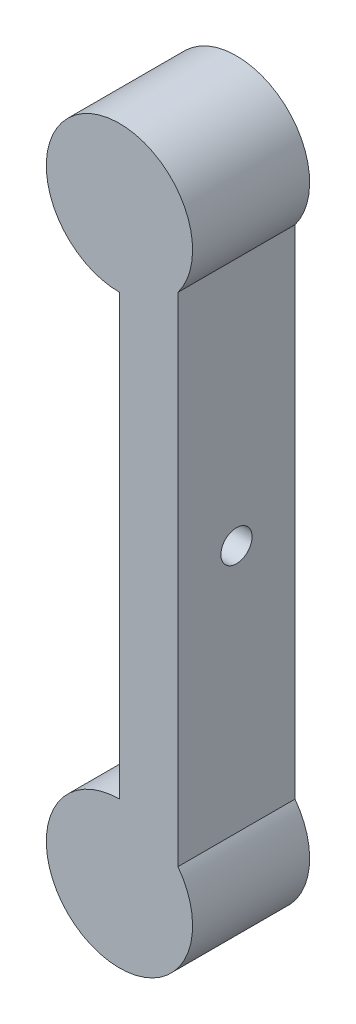
ISO-10303-21;
HEADER;
FILE_DESCRIPTION(('STEP AP214'),'2;1');
FILE_NAME('part.step','',(''),(''),'','','');
FILE_SCHEMA(('AUTOMOTIVE_DESIGN { 1 0 10303 214 1 1 1 1 }'));
ENDSEC;
DATA;
#1=APPLICATION_CONTEXT('core data for automotive mechanical design processes');
#2=APPLICATION_PROTOCOL_DEFINITION('international standard','automotive_design',2000,#1);
#3=PRODUCT_CONTEXT('',#1,'mechanical');
#4=PRODUCT('Part','Part','',(#3));
#5=PRODUCT_RELATED_PRODUCT_CATEGORY('part','',(#4));
#6=PRODUCT_DEFINITION_FORMATION('','',#4);
#7=PRODUCT_DEFINITION_CONTEXT('part definition',#1,'design');
#8=PRODUCT_DEFINITION('design','',#6,#7);
#9=PRODUCT_DEFINITION_SHAPE('','',#8);
#10=(LENGTH_UNIT() NAMED_UNIT(*) SI_UNIT(.MILLI.,.METRE.));
#11=(NAMED_UNIT(*) PLANE_ANGLE_UNIT() SI_UNIT($,.RADIAN.));
#12=(NAMED_UNIT(*) SI_UNIT($,.STERADIAN.) SOLID_ANGLE_UNIT());
#13=UNCERTAINTY_MEASURE_WITH_UNIT(LENGTH_MEASURE(1.E-05),#10,'distance_accuracy_value','');
#14=(GEOMETRIC_REPRESENTATION_CONTEXT(3) GLOBAL_UNCERTAINTY_ASSIGNED_CONTEXT((#13)) GLOBAL_UNIT_ASSIGNED_CONTEXT((#10,
#11,#12)) REPRESENTATION_CONTEXT('',''));
#15=CARTESIAN_POINT('',(0.,0.,0.));
#16=DIRECTION('',(0.,0.,1.));
#17=DIRECTION('',(1.,0.,0.));
#18=AXIS2_PLACEMENT_3D('',#15,#16,#17);
#19=CARTESIAN_POINT('',(0.,60.,0.));
#20=DIRECTION('',(0.,0.,1.));
#21=DIRECTION('',(1.,0.,0.));
#22=AXIS2_PLACEMENT_3D('',#19,#20,#21);
#23=PLANE('',#22);
#24=CARTESIAN_POINT('',(0.,60.,0.));
#25=DIRECTION('',(0.,0.,1.));
#26=DIRECTION('',(1.,0.,0.));
#27=AXIS2_PLACEMENT_3D('',#24,#25,#26);
#28=CIRCLE('',#27,7.5);
#29=CARTESIAN_POINT('',(6.,55.5,0.));
#30=VERTEX_POINT('',#29);
#31=CARTESIAN_POINT('',(0.,52.5,0.));
#32=VERTEX_POINT('',#31);
#33=EDGE_CURVE('E80',#30,#32,#28,.T.);
#34=ORIENTED_EDGE('',*,*,#33,.F.);
#35=DIRECTION('',(0.,1.,0.));
#36=VECTOR('',#35,1.);
#37=CARTESIAN_POINT('',(6.,55.5,0.));
#38=LINE('',#37,#36);
#39=CARTESIAN_POINT('',(6.00000000000001,4.49999999999999,0.));
#40=VERTEX_POINT('',#39);
#41=EDGE_CURVE('E49',#40,#30,#38,.T.);
#42=ORIENTED_EDGE('',*,*,#41,.F.);
#43=CARTESIAN_POINT('',(0.,0.,0.));
#44=DIRECTION('',(0.,0.,1.));
#45=DIRECTION('',(1.,0.,0.));
#46=AXIS2_PLACEMENT_3D('',#43,#44,#45);
#47=CIRCLE('',#46,7.5);
#48=CARTESIAN_POINT('',(0.,7.5,0.));
#49=VERTEX_POINT('',#48);
#50=EDGE_CURVE('E57',#49,#40,#47,.T.);
#51=ORIENTED_EDGE('',*,*,#50,.F.);
#52=DIRECTION('',(0.,-1.,0.));
#53=VECTOR('',#52,1.);
#54=CARTESIAN_POINT('',(0.,52.5,0.));
#55=LINE('',#54,#53);
#56=EDGE_CURVE('E114',#32,#49,#55,.T.);
#57=ORIENTED_EDGE('',*,*,#56,.F.);
#58=EDGE_LOOP('',(#34,#42,#51,#57));
#59=FACE_BOUND('',#58,.T.);
#60=CARTESIAN_POINT('',(0.,60.,0.));
#61=DIRECTION('',(0.,0.,1.));
#62=DIRECTION('',(1.,0.,0.));
#63=AXIS2_PLACEMENT_3D('',#60,#61,#62);
#64=CIRCLE('',#63,4.00000000000001);
#65=CARTESIAN_POINT('',(4.00000000000001,60.,0.));
#66=VERTEX_POINT('',#65);
#67=EDGE_CURVE('E110',#66,#66,#64,.T.);
#68=ORIENTED_EDGE('',*,*,#67,.T.);
#69=EDGE_LOOP('',(#68));
#70=FACE_BOUND('',#69,.T.);
#71=CARTESIAN_POINT('',(0.,0.,0.));
#72=DIRECTION('',(0.,0.,1.));
#73=DIRECTION('',(1.,0.,0.));
#74=AXIS2_PLACEMENT_3D('',#71,#72,#73);
#75=CIRCLE('',#74,4.);
#76=CARTESIAN_POINT('',(4.,0.,0.));
#77=VERTEX_POINT('',#76);
#78=EDGE_CURVE('E107',#77,#77,#75,.T.);
#79=ORIENTED_EDGE('',*,*,#78,.T.);
#80=EDGE_LOOP('',(#79));
#81=FACE_BOUND('',#80,.T.);
#82=ADVANCED_FACE('F33',(#59,#70,#81),#23,.F.);
#83=CARTESIAN_POINT('',(0.,60.,10.));
#84=DIRECTION('',(0.,0.,-1.));
#85=DIRECTION('',(-1.,0.,0.));
#86=AXIS2_PLACEMENT_3D('',#83,#84,#85);
#87=CYLINDRICAL_SURFACE('',#86,7.5);
#88=ORIENTED_EDGE('',*,*,#33,.T.);
#89=DIRECTION('',(0.,0.,-1.));
#90=VECTOR('',#89,1.);
#91=CARTESIAN_POINT('',(0.,52.5,10.));
#92=LINE('',#91,#90);
#93=CARTESIAN_POINT('',(0.,52.5,12.));
#94=VERTEX_POINT('',#93);
#95=EDGE_CURVE('E11',#94,#32,#92,.T.);
#96=ORIENTED_EDGE('',*,*,#95,.F.);
#97=CARTESIAN_POINT('',(0.,60.,12.));
#98=DIRECTION('',(0.,0.,1.));
#99=DIRECTION('',(1.,0.,0.));
#100=AXIS2_PLACEMENT_3D('',#97,#98,#99);
#101=CIRCLE('',#100,7.5);
#102=CARTESIAN_POINT('',(6.,55.5,12.));
#103=VERTEX_POINT('',#102);
#104=EDGE_CURVE('E78',#103,#94,#101,.T.);
#105=ORIENTED_EDGE('',*,*,#104,.F.);
#106=DIRECTION('',(0.,0.,-1.));
#107=VECTOR('',#106,1.);
#108=CARTESIAN_POINT('',(6.,55.5,10.));
#109=LINE('',#108,#107);
#110=EDGE_CURVE('E118',#103,#30,#109,.T.);
#111=ORIENTED_EDGE('',*,*,#110,.T.);
#112=EDGE_LOOP('',(#88,#96,#105,#111));
#113=FACE_BOUND('',#112,.T.);
#114=ADVANCED_FACE('F35',(#113),#87,.T.);
#115=CARTESIAN_POINT('',(0.,52.5,10.));
#116=DIRECTION('',(1.,0.,0.));
#117=DIRECTION('',(0.,1.,0.));
#118=AXIS2_PLACEMENT_3D('',#115,#116,#117);
#119=PLANE('',#118);
#120=CARTESIAN_POINT('',(0.,30.,6.));
#121=DIRECTION('',(-1.,0.,0.));
#122=DIRECTION('',(0.,-1.,0.));
#123=AXIS2_PLACEMENT_3D('',#120,#121,#122);
#124=CIRCLE('',#123,1.6);
#125=CARTESIAN_POINT('',(0.,28.4,6.));
#126=VERTEX_POINT('',#125);
#127=EDGE_CURVE('E96',#126,#126,#124,.T.);
#128=ORIENTED_EDGE('',*,*,#127,.F.);
#129=EDGE_LOOP('',(#128));
#130=FACE_BOUND('',#129,.T.);
#131=ORIENTED_EDGE('',*,*,#56,.T.);
#132=DIRECTION('',(0.,0.,-1.));
#133=VECTOR('',#132,1.);
#134=CARTESIAN_POINT('',(0.,7.5,10.));
#135=LINE('',#134,#133);
#136=CARTESIAN_POINT('',(0.,7.5,12.));
#137=VERTEX_POINT('',#136);
#138=EDGE_CURVE('E42',#137,#49,#135,.T.);
#139=ORIENTED_EDGE('',*,*,#138,.F.);
#140=DIRECTION('',(0.,-1.,0.));
#141=VECTOR('',#140,1.);
#142=CARTESIAN_POINT('',(0.,52.5,12.));
#143=LINE('',#142,#141);
#144=EDGE_CURVE('E83',#94,#137,#143,.T.);
#145=ORIENTED_EDGE('',*,*,#144,.F.);
#146=ORIENTED_EDGE('',*,*,#95,.T.);
#147=EDGE_LOOP('',(#131,#139,#145,#146));
#148=FACE_BOUND('',#147,.T.);
#149=ADVANCED_FACE('F84',(#130,#148),#119,.F.);
#150=CARTESIAN_POINT('',(0.,0.,10.));
#151=DIRECTION('',(0.,0.,-1.));
#152=DIRECTION('',(-1.,0.,0.));
#153=AXIS2_PLACEMENT_3D('',#150,#151,#152);
#154=CYLINDRICAL_SURFACE('',#153,7.5);
#155=ORIENTED_EDGE('',*,*,#50,.T.);
#156=DIRECTION('',(0.,0.,-1.));
#157=VECTOR('',#156,1.);
#158=CARTESIAN_POINT('',(6.00000000000001,4.49999999999999,10.));
#159=LINE('',#158,#157);
#160=CARTESIAN_POINT('',(6.00000000000001,4.49999999999999,12.));
#161=VERTEX_POINT('',#160);
#162=EDGE_CURVE('E120',#161,#40,#159,.T.);
#163=ORIENTED_EDGE('',*,*,#162,.F.);
#164=CARTESIAN_POINT('',(0.,0.,12.));
#165=DIRECTION('',(0.,0.,1.));
#166=DIRECTION('',(1.,0.,0.));
#167=AXIS2_PLACEMENT_3D('',#164,#165,#166);
#168=CIRCLE('',#167,7.5);
#169=EDGE_CURVE('E88',#137,#161,#168,.T.);
#170=ORIENTED_EDGE('',*,*,#169,.F.);
#171=ORIENTED_EDGE('',*,*,#138,.T.);
#172=EDGE_LOOP('',(#155,#163,#170,#171));
#173=FACE_BOUND('',#172,.T.);
#174=ADVANCED_FACE('F122',(#173),#154,.T.);
#175=CARTESIAN_POINT('',(6.,55.5,10.));
#176=DIRECTION('',(-1.,0.,0.));
#177=DIRECTION('',(0.,-1.,0.));
#178=AXIS2_PLACEMENT_3D('',#175,#176,#177);
#179=PLANE('',#178);
#180=CARTESIAN_POINT('',(6.,30.,6.));
#181=DIRECTION('',(-1.,0.,0.));
#182=DIRECTION('',(0.,-1.,0.));
#183=AXIS2_PLACEMENT_3D('',#180,#181,#182);
#184=CIRCLE('',#183,1.6);
#185=CARTESIAN_POINT('',(6.,28.4,6.));
#186=VERTEX_POINT('',#185);
#187=EDGE_CURVE('E37',#186,#186,#184,.T.);
#188=ORIENTED_EDGE('',*,*,#187,.T.);
#189=EDGE_LOOP('',(#188));
#190=FACE_BOUND('',#189,.T.);
#191=ORIENTED_EDGE('',*,*,#41,.T.);
#192=ORIENTED_EDGE('',*,*,#110,.F.);
#193=DIRECTION('',(0.,1.,0.));
#194=VECTOR('',#193,1.);
#195=CARTESIAN_POINT('',(6.,55.5,12.));
#196=LINE('',#195,#194);
#197=EDGE_CURVE('E93',#161,#103,#196,.T.);
#198=ORIENTED_EDGE('',*,*,#197,.F.);
#199=ORIENTED_EDGE('',*,*,#162,.T.);
#200=EDGE_LOOP('',(#191,#192,#198,#199));
#201=FACE_BOUND('',#200,.T.);
#202=ADVANCED_FACE('F144',(#190,#201),#179,.F.);
#203=CARTESIAN_POINT('',(0.,60.,10.));
#204=DIRECTION('',(0.,0.,-1.));
#205=DIRECTION('',(-1.,0.,0.));
#206=AXIS2_PLACEMENT_3D('',#203,#204,#205);
#207=CYLINDRICAL_SURFACE('',#206,4.00000000000001);
#208=CARTESIAN_POINT('',(0.,60.,10.));
#209=DIRECTION('',(0.,0.,1.));
#210=DIRECTION('',(1.,0.,0.));
#211=AXIS2_PLACEMENT_3D('',#208,#209,#210);
#212=CIRCLE('',#211,4.00000000000001);
#213=CARTESIAN_POINT('',(4.00000000000001,60.,10.));
#214=VERTEX_POINT('',#213);
#215=EDGE_CURVE('E104',#214,#214,#212,.T.);
#216=ORIENTED_EDGE('',*,*,#215,.T.);
#217=EDGE_LOOP('',(#216));
#218=FACE_BOUND('',#217,.T.);
#219=ORIENTED_EDGE('',*,*,#67,.F.);
#220=EDGE_LOOP('',(#219));
#221=FACE_BOUND('',#220,.T.);
#222=ADVANCED_FACE('F134',(#218,#221),#207,.F.);
#223=CARTESIAN_POINT('',(0.,0.,10.));
#224=DIRECTION('',(0.,0.,-1.));
#225=DIRECTION('',(-1.,0.,0.));
#226=AXIS2_PLACEMENT_3D('',#223,#224,#225);
#227=CYLINDRICAL_SURFACE('',#226,4.);
#228=CARTESIAN_POINT('',(0.,0.,10.));
#229=DIRECTION('',(0.,0.,1.));
#230=DIRECTION('',(1.,0.,0.));
#231=AXIS2_PLACEMENT_3D('',#228,#229,#230);
#232=CIRCLE('',#231,4.);
#233=CARTESIAN_POINT('',(4.,0.,10.));
#234=VERTEX_POINT('',#233);
#235=EDGE_CURVE('E101',#234,#234,#232,.T.);
#236=ORIENTED_EDGE('',*,*,#235,.T.);
#237=EDGE_LOOP('',(#236));
#238=FACE_BOUND('',#237,.T.);
#239=ORIENTED_EDGE('',*,*,#78,.F.);
#240=EDGE_LOOP('',(#239));
#241=FACE_BOUND('',#240,.T.);
#242=ADVANCED_FACE('F131',(#238,#241),#227,.F.);
#243=CARTESIAN_POINT('',(0.,60.,10.));
#244=DIRECTION('',(0.,0.,1.));
#245=DIRECTION('',(1.,0.,0.));
#246=AXIS2_PLACEMENT_3D('',#243,#244,#245);
#247=PLANE('',#246);
#248=ORIENTED_EDGE('',*,*,#235,.F.);
#249=EDGE_LOOP('',(#248));
#250=FACE_BOUND('',#249,.T.);
#251=ADVANCED_FACE('F133',(#250),#247,.F.);
#252=ORIENTED_EDGE('',*,*,#215,.F.);
#253=EDGE_LOOP('',(#252));
#254=FACE_BOUND('',#253,.T.);
#255=ADVANCED_FACE('F141',(#254),#247,.F.);
#256=CARTESIAN_POINT('',(0.,60.,12.));
#257=DIRECTION('',(0.,0.,1.));
#258=DIRECTION('',(1.,0.,0.));
#259=AXIS2_PLACEMENT_3D('',#256,#257,#258);
#260=PLANE('',#259);
#261=ORIENTED_EDGE('',*,*,#104,.T.);
#262=ORIENTED_EDGE('',*,*,#144,.T.);
#263=ORIENTED_EDGE('',*,*,#169,.T.);
#264=ORIENTED_EDGE('',*,*,#197,.T.);
#265=EDGE_LOOP('',(#261,#262,#263,#264));
#266=FACE_BOUND('',#265,.T.);
#267=ADVANCED_FACE('F91',(#266),#260,.T.);
#268=CARTESIAN_POINT('',(10.,30.,6.));
#269=DIRECTION('',(-1.,0.,0.));
#270=DIRECTION('',(0.,-1.,0.));
#271=AXIS2_PLACEMENT_3D('',#268,#269,#270);
#272=CYLINDRICAL_SURFACE('',#271,1.6);
#273=ORIENTED_EDGE('',*,*,#127,.T.);
#274=EDGE_LOOP('',(#273));
#275=FACE_BOUND('',#274,.T.);
#276=ORIENTED_EDGE('',*,*,#187,.F.);
#277=EDGE_LOOP('',(#276));
#278=FACE_BOUND('',#277,.T.);
#279=ADVANCED_FACE('F161',(#275,#278),#272,.F.);
#280=CLOSED_SHELL('',(#82,#114,#149,#174,#202,#222,#242,#251,#255,#267,#279));
#281=MANIFOLD_SOLID_BREP('B2',#280);
#282=ADVANCED_BREP_SHAPE_REPRESENTATION('',(#18,#281),#14);
#283=SHAPE_DEFINITION_REPRESENTATION(#9,#282);
ENDSEC;
END-ISO-10303-21;
